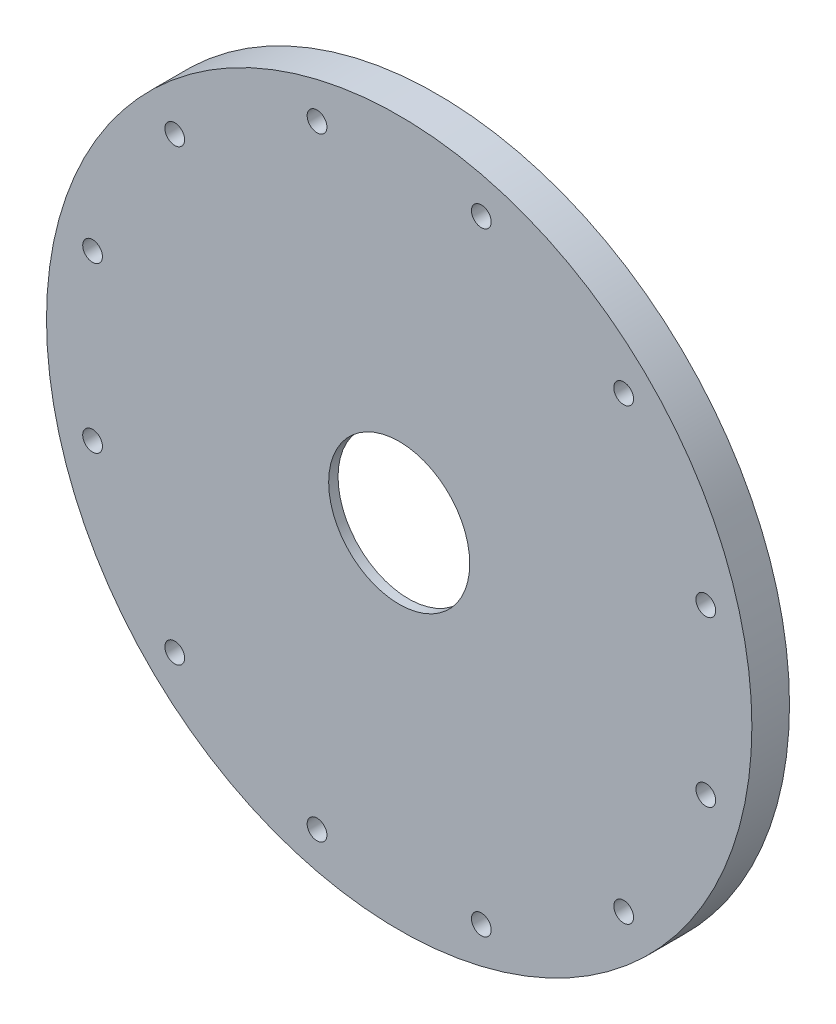
ISO-10303-21;
HEADER;
FILE_DESCRIPTION(('STEP AP214'),'2;1');
FILE_NAME('part.step','',(''),(''),'','','');
FILE_SCHEMA(('AUTOMOTIVE_DESIGN { 1 0 10303 214 1 1 1 1 }'));
ENDSEC;
DATA;
#1=APPLICATION_CONTEXT('core data for automotive mechanical design processes');
#2=APPLICATION_PROTOCOL_DEFINITION('international standard','automotive_design',2000,#1);
#3=PRODUCT_CONTEXT('',#1,'mechanical');
#4=PRODUCT('Part','Part','',(#3));
#5=PRODUCT_RELATED_PRODUCT_CATEGORY('part','',(#4));
#6=PRODUCT_DEFINITION_FORMATION('','',#4);
#7=PRODUCT_DEFINITION_CONTEXT('part definition',#1,'design');
#8=PRODUCT_DEFINITION('design','',#6,#7);
#9=PRODUCT_DEFINITION_SHAPE('','',#8);
#10=(LENGTH_UNIT() NAMED_UNIT(*) SI_UNIT(.MILLI.,.METRE.));
#11=(NAMED_UNIT(*) PLANE_ANGLE_UNIT() SI_UNIT($,.RADIAN.));
#12=(NAMED_UNIT(*) SI_UNIT($,.STERADIAN.) SOLID_ANGLE_UNIT());
#13=UNCERTAINTY_MEASURE_WITH_UNIT(LENGTH_MEASURE(1.E-05),#10,'distance_accuracy_value','');
#14=(GEOMETRIC_REPRESENTATION_CONTEXT(3) GLOBAL_UNCERTAINTY_ASSIGNED_CONTEXT((#13)) GLOBAL_UNIT_ASSIGNED_CONTEXT((#10,
#11,#12)) REPRESENTATION_CONTEXT('',''));
#15=CARTESIAN_POINT('',(0.,0.,0.));
#16=DIRECTION('',(0.,0.,1.));
#17=DIRECTION('',(1.,0.,0.));
#18=AXIS2_PLACEMENT_3D('',#15,#16,#17);
#19=CARTESIAN_POINT('',(0.,0.,0.));
#20=DIRECTION('',(0.,0.,1.));
#21=DIRECTION('',(1.,0.,0.));
#22=AXIS2_PLACEMENT_3D('',#19,#20,#21);
#23=PLANE('',#22);
#24=CARTESIAN_POINT('',(0.,0.,0.));
#25=DIRECTION('',(0.,0.,-1.));
#26=DIRECTION('',(-1.,0.,0.));
#27=AXIS2_PLACEMENT_3D('',#24,#25,#26);
#28=CIRCLE('',#27,58.6475);
#29=CARTESIAN_POINT('',(-58.6475,0.,0.));
#30=VERTEX_POINT('',#29);
#31=EDGE_CURVE('E123',#30,#30,#28,.T.);
#32=ORIENTED_EDGE('',*,*,#31,.F.);
#33=EDGE_LOOP('',(#32));
#34=FACE_BOUND('',#33,.T.);
#35=CARTESIAN_POINT('',(0.,0.,0.));
#36=DIRECTION('',(0.,0.,1.));
#37=DIRECTION('',(1.,0.,0.));
#38=AXIS2_PLACEMENT_3D('',#35,#36,#37);
#39=CIRCLE('',#38,75.);
#40=CARTESIAN_POINT('',(75.,0.,0.));
#41=VERTEX_POINT('',#40);
#42=EDGE_CURVE('E36',#41,#41,#39,.T.);
#43=ORIENTED_EDGE('',*,*,#42,.F.);
#44=EDGE_LOOP('',(#43));
#45=FACE_BOUND('',#44,.T.);
#46=CARTESIAN_POINT('',(17.4702855444206,-65.199993274512,0.));
#47=DIRECTION('',(0.,0.,-1.));
#48=DIRECTION('',(-1.,0.,0.));
#49=AXIS2_PLACEMENT_3D('',#46,#47,#48);
#50=CIRCLE('',#49,2.09999999999999);
#51=CARTESIAN_POINT('',(15.3702855444206,-65.199993274512,0.));
#52=VERTEX_POINT('',#51);
#53=EDGE_CURVE('E47',#52,#52,#50,.T.);
#54=ORIENTED_EDGE('',*,*,#53,.F.);
#55=EDGE_LOOP('',(#54));
#56=FACE_BOUND('',#55,.T.);
#57=CARTESIAN_POINT('',(-17.4702855444206,65.199993274512,0.));
#58=DIRECTION('',(0.,0.,-1.));
#59=DIRECTION('',(-1.,0.,0.));
#60=AXIS2_PLACEMENT_3D('',#57,#58,#59);
#61=CIRCLE('',#60,2.09999999999999);
#62=CARTESIAN_POINT('',(-19.5702855444206,65.199993274512,0.));
#63=VERTEX_POINT('',#62);
#64=EDGE_CURVE('E53',#63,#63,#61,.T.);
#65=ORIENTED_EDGE('',*,*,#64,.F.);
#66=EDGE_LOOP('',(#65));
#67=FACE_BOUND('',#66,.T.);
#68=CARTESIAN_POINT('',(-47.729707730092,47.7297077300919,0.));
#69=DIRECTION('',(0.,0.,-1.));
#70=DIRECTION('',(-1.,0.,0.));
#71=AXIS2_PLACEMENT_3D('',#68,#69,#70);
#72=CIRCLE('',#71,2.09999999999998);
#73=CARTESIAN_POINT('',(-49.829707730092,47.7297077300919,0.));
#74=VERTEX_POINT('',#73);
#75=EDGE_CURVE('E59',#74,#74,#72,.T.);
#76=ORIENTED_EDGE('',*,*,#75,.F.);
#77=EDGE_LOOP('',(#76));
#78=FACE_BOUND('',#77,.T.);
#79=CARTESIAN_POINT('',(-65.1999932745122,17.4702855444198,0.));
#80=DIRECTION('',(0.,0.,-1.));
#81=DIRECTION('',(-1.,0.,0.));
#82=AXIS2_PLACEMENT_3D('',#79,#80,#81);
#83=CIRCLE('',#82,2.09999999999999);
#84=CARTESIAN_POINT('',(-67.2999932745122,17.4702855444198,0.));
#85=VERTEX_POINT('',#84);
#86=EDGE_CURVE('E65',#85,#85,#83,.T.);
#87=ORIENTED_EDGE('',*,*,#86,.F.);
#88=EDGE_LOOP('',(#87));
#89=FACE_BOUND('',#88,.T.);
#90=CARTESIAN_POINT('',(-17.4702855444198,-65.1999932745122,0.));
#91=DIRECTION('',(0.,0.,-1.));
#92=DIRECTION('',(-1.,0.,0.));
#93=AXIS2_PLACEMENT_3D('',#90,#91,#92);
#94=CIRCLE('',#93,2.09999999999999);
#95=CARTESIAN_POINT('',(-19.5702855444198,-65.1999932745122,0.));
#96=VERTEX_POINT('',#95);
#97=EDGE_CURVE('E71',#96,#96,#94,.T.);
#98=ORIENTED_EDGE('',*,*,#97,.F.);
#99=EDGE_LOOP('',(#98));
#100=FACE_BOUND('',#99,.T.);
#101=CARTESIAN_POINT('',(47.729707730092,-47.7297077300919,0.));
#102=DIRECTION('',(0.,0.,-1.));
#103=DIRECTION('',(-1.,0.,0.));
#104=AXIS2_PLACEMENT_3D('',#101,#102,#103);
#105=CIRCLE('',#104,2.09999999999998);
#106=CARTESIAN_POINT('',(45.629707730092,-47.7297077300919,0.));
#107=VERTEX_POINT('',#106);
#108=EDGE_CURVE('E77',#107,#107,#105,.T.);
#109=ORIENTED_EDGE('',*,*,#108,.F.);
#110=EDGE_LOOP('',(#109));
#111=FACE_BOUND('',#110,.T.);
#112=CARTESIAN_POINT('',(65.1999932745122,-17.4702855444198,0.));
#113=DIRECTION('',(0.,0.,-1.));
#114=DIRECTION('',(-1.,0.,0.));
#115=AXIS2_PLACEMENT_3D('',#112,#113,#114);
#116=CIRCLE('',#115,2.09999999999999);
#117=CARTESIAN_POINT('',(63.0999932745122,-17.4702855444198,0.));
#118=VERTEX_POINT('',#117);
#119=EDGE_CURVE('E83',#118,#118,#116,.T.);
#120=ORIENTED_EDGE('',*,*,#119,.F.);
#121=EDGE_LOOP('',(#120));
#122=FACE_BOUND('',#121,.T.);
#123=CARTESIAN_POINT('',(17.4702855444197,65.1999932745122,0.));
#124=DIRECTION('',(0.,0.,-1.));
#125=DIRECTION('',(-1.,0.,0.));
#126=AXIS2_PLACEMENT_3D('',#123,#124,#125);
#127=CIRCLE('',#126,2.09999999999999);
#128=CARTESIAN_POINT('',(15.3702855444198,65.1999932745122,0.));
#129=VERTEX_POINT('',#128);
#130=EDGE_CURVE('E89',#129,#129,#127,.T.);
#131=ORIENTED_EDGE('',*,*,#130,.F.);
#132=EDGE_LOOP('',(#131));
#133=FACE_BOUND('',#132,.T.);
#134=CARTESIAN_POINT('',(65.1999932745119,17.4702855444209,0.));
#135=DIRECTION('',(0.,0.,-1.));
#136=DIRECTION('',(-1.,0.,0.));
#137=AXIS2_PLACEMENT_3D('',#134,#135,#136);
#138=CIRCLE('',#137,2.09999999999999);
#139=CARTESIAN_POINT('',(63.0999932745119,17.4702855444209,0.));
#140=VERTEX_POINT('',#139);
#141=EDGE_CURVE('E95',#140,#140,#138,.T.);
#142=ORIENTED_EDGE('',*,*,#141,.F.);
#143=EDGE_LOOP('',(#142));
#144=FACE_BOUND('',#143,.T.);
#145=CARTESIAN_POINT('',(-47.7297077300923,-47.7297077300916,0.));
#146=DIRECTION('',(0.,0.,-1.));
#147=DIRECTION('',(-1.,0.,0.));
#148=AXIS2_PLACEMENT_3D('',#145,#146,#147);
#149=CIRCLE('',#148,2.09999999999998);
#150=CARTESIAN_POINT('',(-49.8297077300923,-47.7297077300916,0.));
#151=VERTEX_POINT('',#150);
#152=EDGE_CURVE('E101',#151,#151,#149,.T.);
#153=ORIENTED_EDGE('',*,*,#152,.F.);
#154=EDGE_LOOP('',(#153));
#155=FACE_BOUND('',#154,.T.);
#156=CARTESIAN_POINT('',(-65.1999932745121,-17.4702855444202,0.));
#157=DIRECTION('',(0.,0.,-1.));
#158=DIRECTION('',(-1.,0.,0.));
#159=AXIS2_PLACEMENT_3D('',#156,#157,#158);
#160=CIRCLE('',#159,2.09999999999999);
#161=CARTESIAN_POINT('',(-67.2999932745121,-17.4702855444202,0.));
#162=VERTEX_POINT('',#161);
#163=EDGE_CURVE('E107',#162,#162,#160,.T.);
#164=ORIENTED_EDGE('',*,*,#163,.F.);
#165=EDGE_LOOP('',(#164));
#166=FACE_BOUND('',#165,.T.);
#167=CARTESIAN_POINT('',(47.7297077300914,47.7297077300926,0.));
#168=DIRECTION('',(0.,0.,-1.));
#169=DIRECTION('',(-1.,0.,0.));
#170=AXIS2_PLACEMENT_3D('',#167,#168,#169);
#171=CIRCLE('',#170,2.09999999999999);
#172=CARTESIAN_POINT('',(45.6297077300914,47.7297077300926,0.));
#173=VERTEX_POINT('',#172);
#174=EDGE_CURVE('E113',#173,#173,#171,.T.);
#175=ORIENTED_EDGE('',*,*,#174,.F.);
#176=EDGE_LOOP('',(#175));
#177=FACE_BOUND('',#176,.T.);
#178=ADVANCED_FACE('F32',(#34,#45,#56,#67,#78,#89,#100,#111,#122,#133,#144,#155,#166,#177),#23,.F.);
#179=CARTESIAN_POINT('',(0.,0.,8.));
#180=DIRECTION('',(0.,0.,-1.));
#181=DIRECTION('',(-1.,0.,0.));
#182=AXIS2_PLACEMENT_3D('',#179,#180,#181);
#183=CYLINDRICAL_SURFACE('',#182,75.);
#184=CARTESIAN_POINT('',(0.,0.,8.));
#185=DIRECTION('',(0.,0.,1.));
#186=DIRECTION('',(1.,0.,0.));
#187=AXIS2_PLACEMENT_3D('',#184,#185,#186);
#188=CIRCLE('',#187,75.);
#189=CARTESIAN_POINT('',(75.,0.,8.));
#190=VERTEX_POINT('',#189);
#191=EDGE_CURVE('E10',#190,#190,#188,.T.);
#192=ORIENTED_EDGE('',*,*,#191,.F.);
#193=EDGE_LOOP('',(#192));
#194=FACE_BOUND('',#193,.T.);
#195=ORIENTED_EDGE('',*,*,#42,.T.);
#196=EDGE_LOOP('',(#195));
#197=FACE_BOUND('',#196,.T.);
#198=ADVANCED_FACE('F34',(#194,#197),#183,.T.);
#199=CARTESIAN_POINT('',(0.,0.,8.));
#200=DIRECTION('',(0.,0.,1.));
#201=DIRECTION('',(1.,0.,0.));
#202=AXIS2_PLACEMENT_3D('',#199,#200,#201);
#203=PLANE('',#202);
#204=CARTESIAN_POINT('',(0.,0.,8.));
#205=DIRECTION('',(0.,0.,1.));
#206=DIRECTION('',(1.,0.,0.));
#207=AXIS2_PLACEMENT_3D('',#204,#205,#206);
#208=CIRCLE('',#207,15.);
#209=CARTESIAN_POINT('',(15.,0.,8.));
#210=VERTEX_POINT('',#209);
#211=EDGE_CURVE('E132',#210,#210,#208,.F.);
#212=ORIENTED_EDGE('',*,*,#211,.T.);
#213=EDGE_LOOP('',(#212));
#214=FACE_BOUND('',#213,.T.);
#215=CARTESIAN_POINT('',(47.7297077300914,47.7297077300926,8.));
#216=DIRECTION('',(0.,0.,1.));
#217=DIRECTION('',(1.,0.,0.));
#218=AXIS2_PLACEMENT_3D('',#215,#216,#217);
#219=CIRCLE('',#218,2.09999999999999);
#220=CARTESIAN_POINT('',(49.8297077300914,47.7297077300926,8.));
#221=VERTEX_POINT('',#220);
#222=EDGE_CURVE('E110',#221,#221,#219,.T.);
#223=ORIENTED_EDGE('',*,*,#222,.F.);
#224=EDGE_LOOP('',(#223));
#225=FACE_BOUND('',#224,.T.);
#226=CARTESIAN_POINT('',(-65.1999932745121,-17.4702855444202,8.));
#227=DIRECTION('',(0.,0.,1.));
#228=DIRECTION('',(1.,0.,0.));
#229=AXIS2_PLACEMENT_3D('',#226,#227,#228);
#230=CIRCLE('',#229,2.1);
#231=CARTESIAN_POINT('',(-63.0999932745121,-17.4702855444202,8.));
#232=VERTEX_POINT('',#231);
#233=EDGE_CURVE('E104',#232,#232,#230,.T.);
#234=ORIENTED_EDGE('',*,*,#233,.F.);
#235=EDGE_LOOP('',(#234));
#236=FACE_BOUND('',#235,.T.);
#237=CARTESIAN_POINT('',(-47.7297077300923,-47.7297077300916,8.));
#238=DIRECTION('',(0.,0.,1.));
#239=DIRECTION('',(1.,0.,0.));
#240=AXIS2_PLACEMENT_3D('',#237,#238,#239);
#241=CIRCLE('',#240,2.09999999999999);
#242=CARTESIAN_POINT('',(-45.6297077300923,-47.7297077300916,8.));
#243=VERTEX_POINT('',#242);
#244=EDGE_CURVE('E98',#243,#243,#241,.T.);
#245=ORIENTED_EDGE('',*,*,#244,.F.);
#246=EDGE_LOOP('',(#245));
#247=FACE_BOUND('',#246,.T.);
#248=CARTESIAN_POINT('',(65.1999932745119,17.4702855444209,8.));
#249=DIRECTION('',(0.,0.,1.));
#250=DIRECTION('',(1.,0.,0.));
#251=AXIS2_PLACEMENT_3D('',#248,#249,#250);
#252=CIRCLE('',#251,2.1);
#253=CARTESIAN_POINT('',(67.2999932745119,17.4702855444209,8.));
#254=VERTEX_POINT('',#253);
#255=EDGE_CURVE('E92',#254,#254,#252,.T.);
#256=ORIENTED_EDGE('',*,*,#255,.F.);
#257=EDGE_LOOP('',(#256));
#258=FACE_BOUND('',#257,.T.);
#259=CARTESIAN_POINT('',(17.4702855444197,65.1999932745122,8.));
#260=DIRECTION('',(0.,0.,1.));
#261=DIRECTION('',(1.,0.,0.));
#262=AXIS2_PLACEMENT_3D('',#259,#260,#261);
#263=CIRCLE('',#262,2.09999999999999);
#264=CARTESIAN_POINT('',(19.5702855444197,65.1999932745122,8.));
#265=VERTEX_POINT('',#264);
#266=EDGE_CURVE('E86',#265,#265,#263,.T.);
#267=ORIENTED_EDGE('',*,*,#266,.F.);
#268=EDGE_LOOP('',(#267));
#269=FACE_BOUND('',#268,.T.);
#270=CARTESIAN_POINT('',(65.1999932745122,-17.4702855444198,8.));
#271=DIRECTION('',(0.,0.,1.));
#272=DIRECTION('',(1.,0.,0.));
#273=AXIS2_PLACEMENT_3D('',#270,#271,#272);
#274=CIRCLE('',#273,2.1);
#275=CARTESIAN_POINT('',(67.2999932745122,-17.4702855444198,8.));
#276=VERTEX_POINT('',#275);
#277=EDGE_CURVE('E80',#276,#276,#274,.T.);
#278=ORIENTED_EDGE('',*,*,#277,.F.);
#279=EDGE_LOOP('',(#278));
#280=FACE_BOUND('',#279,.T.);
#281=CARTESIAN_POINT('',(47.729707730092,-47.7297077300919,8.));
#282=DIRECTION('',(0.,0.,1.));
#283=DIRECTION('',(1.,0.,0.));
#284=AXIS2_PLACEMENT_3D('',#281,#282,#283);
#285=CIRCLE('',#284,2.09999999999999);
#286=CARTESIAN_POINT('',(49.829707730092,-47.7297077300919,8.));
#287=VERTEX_POINT('',#286);
#288=EDGE_CURVE('E74',#287,#287,#285,.T.);
#289=ORIENTED_EDGE('',*,*,#288,.F.);
#290=EDGE_LOOP('',(#289));
#291=FACE_BOUND('',#290,.T.);
#292=CARTESIAN_POINT('',(-17.4702855444198,-65.1999932745122,8.));
#293=DIRECTION('',(0.,0.,1.));
#294=DIRECTION('',(1.,0.,0.));
#295=AXIS2_PLACEMENT_3D('',#292,#293,#294);
#296=CIRCLE('',#295,2.09999999999999);
#297=CARTESIAN_POINT('',(-15.3702855444198,-65.1999932745122,8.));
#298=VERTEX_POINT('',#297);
#299=EDGE_CURVE('E68',#298,#298,#296,.T.);
#300=ORIENTED_EDGE('',*,*,#299,.F.);
#301=EDGE_LOOP('',(#300));
#302=FACE_BOUND('',#301,.T.);
#303=CARTESIAN_POINT('',(-65.1999932745122,17.4702855444198,8.));
#304=DIRECTION('',(0.,0.,1.));
#305=DIRECTION('',(1.,0.,0.));
#306=AXIS2_PLACEMENT_3D('',#303,#304,#305);
#307=CIRCLE('',#306,2.1);
#308=CARTESIAN_POINT('',(-63.0999932745122,17.4702855444198,8.));
#309=VERTEX_POINT('',#308);
#310=EDGE_CURVE('E62',#309,#309,#307,.T.);
#311=ORIENTED_EDGE('',*,*,#310,.F.);
#312=EDGE_LOOP('',(#311));
#313=FACE_BOUND('',#312,.T.);
#314=CARTESIAN_POINT('',(-47.729707730092,47.7297077300919,8.));
#315=DIRECTION('',(0.,0.,1.));
#316=DIRECTION('',(1.,0.,0.));
#317=AXIS2_PLACEMENT_3D('',#314,#315,#316);
#318=CIRCLE('',#317,2.09999999999999);
#319=CARTESIAN_POINT('',(-45.629707730092,47.7297077300919,8.));
#320=VERTEX_POINT('',#319);
#321=EDGE_CURVE('E56',#320,#320,#318,.T.);
#322=ORIENTED_EDGE('',*,*,#321,.F.);
#323=EDGE_LOOP('',(#322));
#324=FACE_BOUND('',#323,.T.);
#325=CARTESIAN_POINT('',(-17.4702855444206,65.199993274512,8.));
#326=DIRECTION('',(0.,0.,1.));
#327=DIRECTION('',(1.,0.,0.));
#328=AXIS2_PLACEMENT_3D('',#325,#326,#327);
#329=CIRCLE('',#328,2.09999999999999);
#330=CARTESIAN_POINT('',(-15.3702855444206,65.199993274512,8.));
#331=VERTEX_POINT('',#330);
#332=EDGE_CURVE('E50',#331,#331,#329,.T.);
#333=ORIENTED_EDGE('',*,*,#332,.F.);
#334=EDGE_LOOP('',(#333));
#335=FACE_BOUND('',#334,.T.);
#336=CARTESIAN_POINT('',(17.4702855444206,-65.199993274512,8.));
#337=DIRECTION('',(0.,0.,1.));
#338=DIRECTION('',(1.,0.,0.));
#339=AXIS2_PLACEMENT_3D('',#336,#337,#338);
#340=CIRCLE('',#339,2.09999999999999);
#341=CARTESIAN_POINT('',(19.5702855444206,-65.199993274512,8.));
#342=VERTEX_POINT('',#341);
#343=EDGE_CURVE('E43',#342,#342,#340,.T.);
#344=ORIENTED_EDGE('',*,*,#343,.F.);
#345=EDGE_LOOP('',(#344));
#346=FACE_BOUND('',#345,.T.);
#347=ORIENTED_EDGE('',*,*,#191,.T.);
#348=EDGE_LOOP('',(#347));
#349=FACE_BOUND('',#348,.T.);
#350=ADVANCED_FACE('F178',(#214,#225,#236,#247,#258,#269,#280,#291,#302,#313,#324,#335,#346,
#349),#203,.T.);
#351=CARTESIAN_POINT('',(17.4702855444206,-65.199993274512,0.));
#352=DIRECTION('',(0.,0.,-1.));
#353=DIRECTION('',(-1.,0.,0.));
#354=AXIS2_PLACEMENT_3D('',#351,#352,#353);
#355=CYLINDRICAL_SURFACE('',#354,2.09999999999999);
#356=ORIENTED_EDGE('',*,*,#53,.T.);
#357=EDGE_LOOP('',(#356));
#358=FACE_BOUND('',#357,.T.);
#359=ORIENTED_EDGE('',*,*,#343,.T.);
#360=EDGE_LOOP('',(#359));
#361=FACE_BOUND('',#360,.T.);
#362=ADVANCED_FACE('F185',(#358,#361),#355,.F.);
#363=CARTESIAN_POINT('',(-17.4702855444206,65.199993274512,0.));
#364=DIRECTION('',(0.,0.,-1.));
#365=DIRECTION('',(-1.,0.,0.));
#366=AXIS2_PLACEMENT_3D('',#363,#364,#365);
#367=CYLINDRICAL_SURFACE('',#366,2.09999999999999);
#368=ORIENTED_EDGE('',*,*,#64,.T.);
#369=EDGE_LOOP('',(#368));
#370=FACE_BOUND('',#369,.T.);
#371=ORIENTED_EDGE('',*,*,#332,.T.);
#372=EDGE_LOOP('',(#371));
#373=FACE_BOUND('',#372,.T.);
#374=ADVANCED_FACE('F189',(#370,#373),#367,.F.);
#375=CARTESIAN_POINT('',(-47.729707730092,47.7297077300919,0.));
#376=DIRECTION('',(0.,0.,-1.));
#377=DIRECTION('',(-1.,0.,0.));
#378=AXIS2_PLACEMENT_3D('',#375,#376,#377);
#379=CYLINDRICAL_SURFACE('',#378,2.09999999999999);
#380=ORIENTED_EDGE('',*,*,#75,.T.);
#381=EDGE_LOOP('',(#380));
#382=FACE_BOUND('',#381,.T.);
#383=ORIENTED_EDGE('',*,*,#321,.T.);
#384=EDGE_LOOP('',(#383));
#385=FACE_BOUND('',#384,.T.);
#386=ADVANCED_FACE('F193',(#382,#385),#379,.F.);
#387=CARTESIAN_POINT('',(-65.1999932745122,17.4702855444198,0.));
#388=DIRECTION('',(0.,0.,-1.));
#389=DIRECTION('',(-1.,0.,0.));
#390=AXIS2_PLACEMENT_3D('',#387,#388,#389);
#391=CYLINDRICAL_SURFACE('',#390,2.1);
#392=ORIENTED_EDGE('',*,*,#86,.T.);
#393=EDGE_LOOP('',(#392));
#394=FACE_BOUND('',#393,.T.);
#395=ORIENTED_EDGE('',*,*,#310,.T.);
#396=EDGE_LOOP('',(#395));
#397=FACE_BOUND('',#396,.T.);
#398=ADVANCED_FACE('F197',(#394,#397),#391,.F.);
#399=CARTESIAN_POINT('',(-17.4702855444198,-65.1999932745122,0.));
#400=DIRECTION('',(0.,0.,-1.));
#401=DIRECTION('',(-1.,0.,0.));
#402=AXIS2_PLACEMENT_3D('',#399,#400,#401);
#403=CYLINDRICAL_SURFACE('',#402,2.09999999999999);
#404=ORIENTED_EDGE('',*,*,#97,.T.);
#405=EDGE_LOOP('',(#404));
#406=FACE_BOUND('',#405,.T.);
#407=ORIENTED_EDGE('',*,*,#299,.T.);
#408=EDGE_LOOP('',(#407));
#409=FACE_BOUND('',#408,.T.);
#410=ADVANCED_FACE('F201',(#406,#409),#403,.F.);
#411=CARTESIAN_POINT('',(47.729707730092,-47.7297077300919,0.));
#412=DIRECTION('',(0.,0.,-1.));
#413=DIRECTION('',(-1.,0.,0.));
#414=AXIS2_PLACEMENT_3D('',#411,#412,#413);
#415=CYLINDRICAL_SURFACE('',#414,2.09999999999999);
#416=ORIENTED_EDGE('',*,*,#108,.T.);
#417=EDGE_LOOP('',(#416));
#418=FACE_BOUND('',#417,.T.);
#419=ORIENTED_EDGE('',*,*,#288,.T.);
#420=EDGE_LOOP('',(#419));
#421=FACE_BOUND('',#420,.T.);
#422=ADVANCED_FACE('F205',(#418,#421),#415,.F.);
#423=CARTESIAN_POINT('',(65.1999932745122,-17.4702855444198,0.));
#424=DIRECTION('',(0.,0.,-1.));
#425=DIRECTION('',(-1.,0.,0.));
#426=AXIS2_PLACEMENT_3D('',#423,#424,#425);
#427=CYLINDRICAL_SURFACE('',#426,2.1);
#428=ORIENTED_EDGE('',*,*,#119,.T.);
#429=EDGE_LOOP('',(#428));
#430=FACE_BOUND('',#429,.T.);
#431=ORIENTED_EDGE('',*,*,#277,.T.);
#432=EDGE_LOOP('',(#431));
#433=FACE_BOUND('',#432,.T.);
#434=ADVANCED_FACE('F209',(#430,#433),#427,.F.);
#435=CARTESIAN_POINT('',(17.4702855444197,65.1999932745122,0.));
#436=DIRECTION('',(0.,0.,-1.));
#437=DIRECTION('',(-1.,0.,0.));
#438=AXIS2_PLACEMENT_3D('',#435,#436,#437);
#439=CYLINDRICAL_SURFACE('',#438,2.09999999999999);
#440=ORIENTED_EDGE('',*,*,#130,.T.);
#441=EDGE_LOOP('',(#440));
#442=FACE_BOUND('',#441,.T.);
#443=ORIENTED_EDGE('',*,*,#266,.T.);
#444=EDGE_LOOP('',(#443));
#445=FACE_BOUND('',#444,.T.);
#446=ADVANCED_FACE('F213',(#442,#445),#439,.F.);
#447=CARTESIAN_POINT('',(65.1999932745119,17.4702855444209,0.));
#448=DIRECTION('',(0.,0.,-1.));
#449=DIRECTION('',(-1.,0.,0.));
#450=AXIS2_PLACEMENT_3D('',#447,#448,#449);
#451=CYLINDRICAL_SURFACE('',#450,2.1);
#452=ORIENTED_EDGE('',*,*,#141,.T.);
#453=EDGE_LOOP('',(#452));
#454=FACE_BOUND('',#453,.T.);
#455=ORIENTED_EDGE('',*,*,#255,.T.);
#456=EDGE_LOOP('',(#455));
#457=FACE_BOUND('',#456,.T.);
#458=ADVANCED_FACE('F217',(#454,#457),#451,.F.);
#459=CARTESIAN_POINT('',(-47.7297077300923,-47.7297077300916,0.));
#460=DIRECTION('',(0.,0.,-1.));
#461=DIRECTION('',(-1.,0.,0.));
#462=AXIS2_PLACEMENT_3D('',#459,#460,#461);
#463=CYLINDRICAL_SURFACE('',#462,2.09999999999999);
#464=ORIENTED_EDGE('',*,*,#152,.T.);
#465=EDGE_LOOP('',(#464));
#466=FACE_BOUND('',#465,.T.);
#467=ORIENTED_EDGE('',*,*,#244,.T.);
#468=EDGE_LOOP('',(#467));
#469=FACE_BOUND('',#468,.T.);
#470=ADVANCED_FACE('F221',(#466,#469),#463,.F.);
#471=CARTESIAN_POINT('',(-65.1999932745121,-17.4702855444202,0.));
#472=DIRECTION('',(0.,0.,-1.));
#473=DIRECTION('',(-1.,0.,0.));
#474=AXIS2_PLACEMENT_3D('',#471,#472,#473);
#475=CYLINDRICAL_SURFACE('',#474,2.1);
#476=ORIENTED_EDGE('',*,*,#163,.T.);
#477=EDGE_LOOP('',(#476));
#478=FACE_BOUND('',#477,.T.);
#479=ORIENTED_EDGE('',*,*,#233,.T.);
#480=EDGE_LOOP('',(#479));
#481=FACE_BOUND('',#480,.T.);
#482=ADVANCED_FACE('F225',(#478,#481),#475,.F.);
#483=CARTESIAN_POINT('',(47.7297077300914,47.7297077300926,0.));
#484=DIRECTION('',(0.,0.,-1.));
#485=DIRECTION('',(-1.,0.,0.));
#486=AXIS2_PLACEMENT_3D('',#483,#484,#485);
#487=CYLINDRICAL_SURFACE('',#486,2.09999999999999);
#488=ORIENTED_EDGE('',*,*,#174,.T.);
#489=EDGE_LOOP('',(#488));
#490=FACE_BOUND('',#489,.T.);
#491=ORIENTED_EDGE('',*,*,#222,.T.);
#492=EDGE_LOOP('',(#491));
#493=FACE_BOUND('',#492,.T.);
#494=ADVANCED_FACE('F229',(#490,#493),#487,.F.);
#495=CARTESIAN_POINT('',(0.,0.,4.));
#496=DIRECTION('',(0.,0.,-1.));
#497=DIRECTION('',(-1.,0.,0.));
#498=AXIS2_PLACEMENT_3D('',#495,#496,#497);
#499=CYLINDRICAL_SURFACE('',#498,58.6475);
#500=CARTESIAN_POINT('',(0.,0.,4.));
#501=DIRECTION('',(0.,0.,-1.));
#502=DIRECTION('',(-1.,0.,0.));
#503=AXIS2_PLACEMENT_3D('',#500,#501,#502);
#504=CIRCLE('',#503,58.6475);
#505=CARTESIAN_POINT('',(-58.6475,0.,4.));
#506=VERTEX_POINT('',#505);
#507=EDGE_CURVE('E120',#506,#506,#504,.T.);
#508=ORIENTED_EDGE('',*,*,#507,.F.);
#509=EDGE_LOOP('',(#508));
#510=FACE_BOUND('',#509,.T.);
#511=ORIENTED_EDGE('',*,*,#31,.T.);
#512=EDGE_LOOP('',(#511));
#513=FACE_BOUND('',#512,.T.);
#514=ADVANCED_FACE('F169',(#510,#513),#499,.F.);
#515=CARTESIAN_POINT('',(0.,0.,4.));
#516=DIRECTION('',(0.,0.,-1.));
#517=DIRECTION('',(-1.,0.,0.));
#518=AXIS2_PLACEMENT_3D('',#515,#516,#517);
#519=PLANE('',#518);
#520=CARTESIAN_POINT('',(0.,0.,4.));
#521=DIRECTION('',(0.,0.,-1.));
#522=DIRECTION('',(-1.,0.,0.));
#523=AXIS2_PLACEMENT_3D('',#520,#521,#522);
#524=CIRCLE('',#523,53.6575);
#525=CARTESIAN_POINT('',(-53.6574999999999,0.,4.));
#526=VERTEX_POINT('',#525);
#527=EDGE_CURVE('E126',#526,#526,#524,.T.);
#528=ORIENTED_EDGE('',*,*,#527,.F.);
#529=EDGE_LOOP('',(#528));
#530=FACE_BOUND('',#529,.T.);
#531=ORIENTED_EDGE('',*,*,#507,.T.);
#532=EDGE_LOOP('',(#531));
#533=FACE_BOUND('',#532,.T.);
#534=ADVANCED_FACE('F163',(#530,#533),#519,.T.);
#535=CARTESIAN_POINT('',(0.,0.,4.));
#536=DIRECTION('',(0.,0.,-1.));
#537=DIRECTION('',(-1.,0.,0.));
#538=AXIS2_PLACEMENT_3D('',#535,#536,#537);
#539=CYLINDRICAL_SURFACE('',#538,53.6575);
#540=ORIENTED_EDGE('',*,*,#527,.T.);
#541=EDGE_LOOP('',(#540));
#542=FACE_BOUND('',#541,.T.);
#543=CARTESIAN_POINT('',(0.,0.,0.));
#544=DIRECTION('',(0.,0.,-1.));
#545=DIRECTION('',(-1.,0.,0.));
#546=AXIS2_PLACEMENT_3D('',#543,#544,#545);
#547=CIRCLE('',#546,53.6575);
#548=CARTESIAN_POINT('',(-53.6574999999999,0.,0.));
#549=VERTEX_POINT('',#548);
#550=EDGE_CURVE('E129',#549,#549,#547,.T.);
#551=ORIENTED_EDGE('',*,*,#550,.F.);
#552=EDGE_LOOP('',(#551));
#553=FACE_BOUND('',#552,.T.);
#554=ADVANCED_FACE('F148',(#542,#553),#539,.T.);
#555=CARTESIAN_POINT('',(0.,0.,6.));
#556=DIRECTION('',(0.,0.,-1.));
#557=DIRECTION('',(-1.,0.,0.));
#558=AXIS2_PLACEMENT_3D('',#555,#556,#557);
#559=PLANE('',#558);
#560=CARTESIAN_POINT('',(0.,0.,6.));
#561=DIRECTION('',(0.,0.,-1.));
#562=DIRECTION('',(-1.,0.,0.));
#563=AXIS2_PLACEMENT_3D('',#560,#561,#562);
#564=CIRCLE('',#563,15.);
#565=CARTESIAN_POINT('',(-15.,0.,6.));
#566=VERTEX_POINT('',#565);
#567=EDGE_CURVE('E137',#566,#566,#564,.T.);
#568=ORIENTED_EDGE('',*,*,#567,.F.);
#569=EDGE_LOOP('',(#568));
#570=FACE_BOUND('',#569,.T.);
#571=CARTESIAN_POINT('',(0.,0.,6.));
#572=DIRECTION('',(0.,0.,-1.));
#573=DIRECTION('',(-1.,0.,0.));
#574=AXIS2_PLACEMENT_3D('',#571,#572,#573);
#575=CIRCLE('',#574,50.2);
#576=CARTESIAN_POINT('',(-50.2,0.,6.));
#577=VERTEX_POINT('',#576);
#578=EDGE_CURVE('E116',#577,#577,#575,.T.);
#579=ORIENTED_EDGE('',*,*,#578,.T.);
#580=EDGE_LOOP('',(#579));
#581=FACE_BOUND('',#580,.T.);
#582=ADVANCED_FACE('F144',(#570,#581),#559,.T.);
#583=CARTESIAN_POINT('',(0.,0.,6.));
#584=DIRECTION('',(0.,0.,-1.));
#585=DIRECTION('',(-1.,0.,0.));
#586=AXIS2_PLACEMENT_3D('',#583,#584,#585);
#587=CYLINDRICAL_SURFACE('',#586,50.2);
#588=ORIENTED_EDGE('',*,*,#578,.F.);
#589=EDGE_LOOP('',(#588));
#590=FACE_BOUND('',#589,.T.);
#591=CARTESIAN_POINT('',(0.,0.,0.));
#592=DIRECTION('',(0.,0.,-1.));
#593=DIRECTION('',(-1.,0.,0.));
#594=AXIS2_PLACEMENT_3D('',#591,#592,#593);
#595=CIRCLE('',#594,50.2);
#596=CARTESIAN_POINT('',(-50.2,0.,0.));
#597=VERTEX_POINT('',#596);
#598=EDGE_CURVE('E117',#597,#597,#595,.T.);
#599=ORIENTED_EDGE('',*,*,#598,.T.);
#600=EDGE_LOOP('',(#599));
#601=FACE_BOUND('',#600,.T.);
#602=ADVANCED_FACE('F147',(#590,#601),#587,.F.);
#603=ORIENTED_EDGE('',*,*,#598,.F.);
#604=EDGE_LOOP('',(#603));
#605=FACE_BOUND('',#604,.T.);
#606=ORIENTED_EDGE('',*,*,#550,.T.);
#607=EDGE_LOOP('',(#606));
#608=FACE_BOUND('',#607,.T.);
#609=ADVANCED_FACE('F154',(#605,#608),#23,.F.);
#610=CARTESIAN_POINT('',(0.,0.,50.4264068711929));
#611=DIRECTION('',(0.,0.,-1.));
#612=DIRECTION('',(-1.,0.,0.));
#613=AXIS2_PLACEMENT_3D('',#610,#611,#612);
#614=CYLINDRICAL_SURFACE('',#613,15.);
#615=ORIENTED_EDGE('',*,*,#567,.T.);
#616=EDGE_LOOP('',(#615));
#617=FACE_BOUND('',#616,.T.);
#618=ORIENTED_EDGE('',*,*,#211,.F.);
#619=EDGE_LOOP('',(#618));
#620=FACE_BOUND('',#619,.T.);
#621=ADVANCED_FACE('F141',(#617,#620),#614,.F.);
#622=CLOSED_SHELL('',(#178,#198,#350,#362,#374,#386,#398,#410,#422,#434,#446,#458,#470,#482,
#494,#514,#534,#554,#582,#602,#609,#621));
#623=MANIFOLD_SOLID_BREP('B2',#622);
#624=ADVANCED_BREP_SHAPE_REPRESENTATION('',(#18,#623),#14);
#625=SHAPE_DEFINITION_REPRESENTATION(#9,#624);
ENDSEC;
END-ISO-10303-21;
